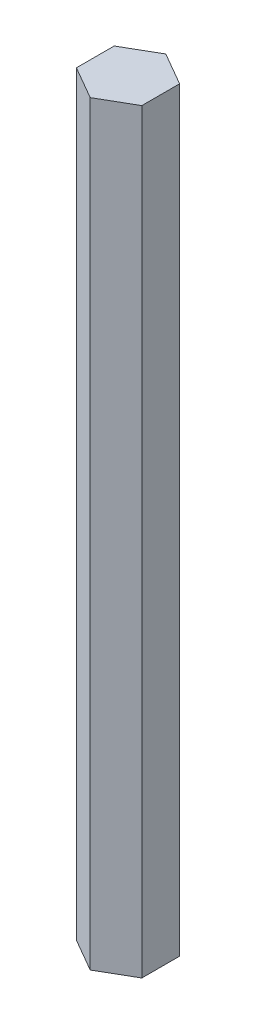
ISO-10303-21;
HEADER;
FILE_DESCRIPTION(('STEP AP214'),'2;1');
FILE_NAME('part.step','',(''),(''),'','','');
FILE_SCHEMA(('AUTOMOTIVE_DESIGN { 1 0 10303 214 1 1 1 1 }'));
ENDSEC;
DATA;
#1=APPLICATION_CONTEXT('core data for automotive mechanical design processes');
#2=APPLICATION_PROTOCOL_DEFINITION('international standard','automotive_design',2000,#1);
#3=PRODUCT_CONTEXT('',#1,'mechanical');
#4=PRODUCT('Part','Part','',(#3));
#5=PRODUCT_RELATED_PRODUCT_CATEGORY('part','',(#4));
#6=PRODUCT_DEFINITION_FORMATION('','',#4);
#7=PRODUCT_DEFINITION_CONTEXT('part definition',#1,'design');
#8=PRODUCT_DEFINITION('design','',#6,#7);
#9=PRODUCT_DEFINITION_SHAPE('','',#8);
#10=(LENGTH_UNIT() NAMED_UNIT(*) SI_UNIT(.MILLI.,.METRE.));
#11=(NAMED_UNIT(*) PLANE_ANGLE_UNIT() SI_UNIT($,.RADIAN.));
#12=(NAMED_UNIT(*) SI_UNIT($,.STERADIAN.) SOLID_ANGLE_UNIT());
#13=UNCERTAINTY_MEASURE_WITH_UNIT(LENGTH_MEASURE(1.E-05),#10,'distance_accuracy_value','');
#14=(GEOMETRIC_REPRESENTATION_CONTEXT(3) GLOBAL_UNCERTAINTY_ASSIGNED_CONTEXT((#13)) GLOBAL_UNIT_ASSIGNED_CONTEXT((#10,
#11,#12)) REPRESENTATION_CONTEXT('',''));
#15=CARTESIAN_POINT('',(0.,0.,0.));
#16=DIRECTION('',(0.,0.,1.));
#17=DIRECTION('',(1.,0.,0.));
#18=AXIS2_PLACEMENT_3D('',#15,#16,#17);
#19=CARTESIAN_POINT('',(-5.49926131403115,127.,3.17500000000006));
#20=DIRECTION('',(0.499999999999995,0.,-0.866025403784441));
#21=DIRECTION('',(-0.866025403784442,0.,-0.499999999999995));
#22=AXIS2_PLACEMENT_3D('',#19,#20,#21);
#23=PLANE('',#22);
#24=DIRECTION('',(0.866025403784441,0.,0.499999999999995));
#25=VECTOR('',#24,1.);
#26=CARTESIAN_POINT('',(-5.49926131403115,0.,3.17500000000006));
#27=LINE('',#26,#25);
#28=CARTESIAN_POINT('',(-5.49926131403115,0.,3.17500000000006));
#29=VERTEX_POINT('',#28);
#30=CARTESIAN_POINT('',(0.,0.,6.35));
#31=VERTEX_POINT('',#30);
#32=EDGE_CURVE('E117',#29,#31,#27,.T.);
#33=ORIENTED_EDGE('',*,*,#32,.T.);
#34=DIRECTION('',(0.,-1.,0.));
#35=VECTOR('',#34,1.);
#36=CARTESIAN_POINT('',(0.,127.,6.35));
#37=LINE('',#36,#35);
#38=CARTESIAN_POINT('',(0.,127.,6.35));
#39=VERTEX_POINT('',#38);
#40=EDGE_CURVE('E11',#39,#31,#37,.T.);
#41=ORIENTED_EDGE('',*,*,#40,.F.);
#42=DIRECTION('',(0.866025403784441,0.,0.499999999999995));
#43=VECTOR('',#42,1.);
#44=CARTESIAN_POINT('',(-5.49926131403115,127.,3.17500000000006));
#45=LINE('',#44,#43);
#46=CARTESIAN_POINT('',(-5.49926131403115,127.,3.17500000000006));
#47=VERTEX_POINT('',#46);
#48=EDGE_CURVE('E127',#47,#39,#45,.T.);
#49=ORIENTED_EDGE('',*,*,#48,.F.);
#50=DIRECTION('',(0.,-1.,0.));
#51=VECTOR('',#50,1.);
#52=CARTESIAN_POINT('',(-5.49926131403115,127.,3.17500000000006));
#53=LINE('',#52,#51);
#54=EDGE_CURVE('E113',#47,#29,#53,.T.);
#55=ORIENTED_EDGE('',*,*,#54,.T.);
#56=EDGE_LOOP('',(#33,#41,#49,#55));
#57=FACE_BOUND('',#56,.T.);
#58=ADVANCED_FACE('F33',(#57),#23,.F.);
#59=CARTESIAN_POINT('',(0.,127.,6.35));
#60=DIRECTION('',(-0.500000000000001,0.,-0.866025403784438));
#61=DIRECTION('',(-0.866025403784438,0.,0.500000000000001));
#62=AXIS2_PLACEMENT_3D('',#59,#60,#61);
#63=PLANE('',#62);
#64=DIRECTION('',(0.866025403784438,0.,-0.500000000000001));
#65=VECTOR('',#64,1.);
#66=CARTESIAN_POINT('',(0.,0.,6.35));
#67=LINE('',#66,#65);
#68=CARTESIAN_POINT('',(5.49926131403119,0.,3.17499999999999));
#69=VERTEX_POINT('',#68);
#70=EDGE_CURVE('E120',#31,#69,#67,.T.);
#71=ORIENTED_EDGE('',*,*,#70,.T.);
#72=DIRECTION('',(0.,-1.,0.));
#73=VECTOR('',#72,1.);
#74=CARTESIAN_POINT('',(5.49926131403119,127.,3.17499999999999));
#75=LINE('',#74,#73);
#76=CARTESIAN_POINT('',(5.49926131403119,127.,3.17499999999999));
#77=VERTEX_POINT('',#76);
#78=EDGE_CURVE('E41',#77,#69,#75,.T.);
#79=ORIENTED_EDGE('',*,*,#78,.F.);
#80=DIRECTION('',(0.866025403784438,0.,-0.500000000000001));
#81=VECTOR('',#80,1.);
#82=CARTESIAN_POINT('',(0.,127.,6.35));
#83=LINE('',#82,#81);
#84=EDGE_CURVE('E86',#39,#77,#83,.T.);
#85=ORIENTED_EDGE('',*,*,#84,.F.);
#86=ORIENTED_EDGE('',*,*,#40,.T.);
#87=EDGE_LOOP('',(#71,#79,#85,#86));
#88=FACE_BOUND('',#87,.T.);
#89=ADVANCED_FACE('F151',(#88),#63,.F.);
#90=CARTESIAN_POINT('',(5.49926131403119,127.,3.17499999999999));
#91=DIRECTION('',(-1.,0.,0.));
#92=DIRECTION('',(0.,0.,1.));
#93=AXIS2_PLACEMENT_3D('',#90,#91,#92);
#94=PLANE('',#93);
#95=DIRECTION('',(0.,0.,-1.));
#96=VECTOR('',#95,1.);
#97=CARTESIAN_POINT('',(5.49926131403119,0.,3.17499999999999));
#98=LINE('',#97,#96);
#99=CARTESIAN_POINT('',(5.49926131403117,0.,-3.17500000000003));
#100=VERTEX_POINT('',#99);
#101=EDGE_CURVE('E122',#69,#100,#98,.T.);
#102=ORIENTED_EDGE('',*,*,#101,.T.);
#103=DIRECTION('',(0.,-1.,0.));
#104=VECTOR('',#103,1.);
#105=CARTESIAN_POINT('',(5.49926131403117,127.,-3.17500000000003));
#106=LINE('',#105,#104);
#107=CARTESIAN_POINT('',(5.49926131403117,127.,-3.17500000000003));
#108=VERTEX_POINT('',#107);
#109=EDGE_CURVE('E108',#108,#100,#106,.T.);
#110=ORIENTED_EDGE('',*,*,#109,.F.);
#111=DIRECTION('',(0.,0.,-1.));
#112=VECTOR('',#111,1.);
#113=CARTESIAN_POINT('',(5.49926131403119,127.,3.17499999999999));
#114=LINE('',#113,#112);
#115=EDGE_CURVE('E99',#77,#108,#114,.T.);
#116=ORIENTED_EDGE('',*,*,#115,.F.);
#117=ORIENTED_EDGE('',*,*,#78,.T.);
#118=EDGE_LOOP('',(#102,#110,#116,#117));
#119=FACE_BOUND('',#118,.T.);
#120=ADVANCED_FACE('F133',(#119),#94,.F.);
#121=CARTESIAN_POINT('',(5.49926131403117,127.,-3.17500000000003));
#122=DIRECTION('',(-0.499999999999995,0.,0.866025403784441));
#123=DIRECTION('',(0.866025403784441,0.,0.499999999999995));
#124=AXIS2_PLACEMENT_3D('',#121,#122,#123);
#125=PLANE('',#124);
#126=DIRECTION('',(-0.866025403784441,0.,-0.499999999999995));
#127=VECTOR('',#126,1.);
#128=CARTESIAN_POINT('',(5.49926131403117,0.,-3.17500000000003));
#129=LINE('',#128,#127);
#130=CARTESIAN_POINT('',(0.,0.,-6.35));
#131=VERTEX_POINT('',#130);
#132=EDGE_CURVE('E107',#100,#131,#129,.T.);
#133=ORIENTED_EDGE('',*,*,#132,.T.);
#134=DIRECTION('',(0.,-1.,0.));
#135=VECTOR('',#134,1.);
#136=CARTESIAN_POINT('',(0.,127.,-6.35));
#137=LINE('',#136,#135);
#138=CARTESIAN_POINT('',(0.,127.,-6.35));
#139=VERTEX_POINT('',#138);
#140=EDGE_CURVE('E104',#139,#131,#137,.T.);
#141=ORIENTED_EDGE('',*,*,#140,.F.);
#142=DIRECTION('',(-0.866025403784441,0.,-0.499999999999995));
#143=VECTOR('',#142,1.);
#144=CARTESIAN_POINT('',(5.49926131403117,127.,-3.17500000000003));
#145=LINE('',#144,#143);
#146=EDGE_CURVE('E93',#108,#139,#145,.T.);
#147=ORIENTED_EDGE('',*,*,#146,.F.);
#148=ORIENTED_EDGE('',*,*,#109,.T.);
#149=EDGE_LOOP('',(#133,#141,#147,#148));
#150=FACE_BOUND('',#149,.T.);
#151=ADVANCED_FACE('F105',(#150),#125,.F.);
#152=CARTESIAN_POINT('',(0.,127.,-6.35));
#153=DIRECTION('',(0.500000000000007,0.,0.866025403784434));
#154=DIRECTION('',(0.866025403784435,0.,-0.500000000000007));
#155=AXIS2_PLACEMENT_3D('',#152,#153,#154);
#156=PLANE('',#155);
#157=DIRECTION('',(-0.866025403784434,0.,0.500000000000007));
#158=VECTOR('',#157,1.);
#159=CARTESIAN_POINT('',(0.,0.,-6.35));
#160=LINE('',#159,#158);
#161=CARTESIAN_POINT('',(-5.49926131403121,0.,-3.17499999999995));
#162=VERTEX_POINT('',#161);
#163=EDGE_CURVE('E72',#131,#162,#160,.T.);
#164=ORIENTED_EDGE('',*,*,#163,.T.);
#165=DIRECTION('',(0.,-1.,0.));
#166=VECTOR('',#165,1.);
#167=CARTESIAN_POINT('',(-5.49926131403121,127.,-3.17499999999995));
#168=LINE('',#167,#166);
#169=CARTESIAN_POINT('',(-5.49926131403121,127.,-3.17499999999995));
#170=VERTEX_POINT('',#169);
#171=EDGE_CURVE('E109',#170,#162,#168,.T.);
#172=ORIENTED_EDGE('',*,*,#171,.F.);
#173=DIRECTION('',(-0.866025403784434,0.,0.500000000000007));
#174=VECTOR('',#173,1.);
#175=CARTESIAN_POINT('',(0.,127.,-6.35));
#176=LINE('',#175,#174);
#177=EDGE_CURVE('E97',#139,#170,#176,.T.);
#178=ORIENTED_EDGE('',*,*,#177,.F.);
#179=ORIENTED_EDGE('',*,*,#140,.T.);
#180=EDGE_LOOP('',(#164,#172,#178,#179));
#181=FACE_BOUND('',#180,.T.);
#182=ADVANCED_FACE('F111',(#181),#156,.F.);
#183=CARTESIAN_POINT('',(-5.49926131403121,127.,-3.17499999999995));
#184=DIRECTION('',(1.,0.,0.));
#185=DIRECTION('',(0.,0.,-1.));
#186=AXIS2_PLACEMENT_3D('',#183,#184,#185);
#187=PLANE('',#186);
#188=DIRECTION('',(0.,0.,1.));
#189=VECTOR('',#188,1.);
#190=CARTESIAN_POINT('',(-5.49926131403121,0.,-3.17499999999995));
#191=LINE('',#190,#189);
#192=EDGE_CURVE('E78',#162,#29,#191,.T.);
#193=ORIENTED_EDGE('',*,*,#192,.T.);
#194=ORIENTED_EDGE('',*,*,#54,.F.);
#195=DIRECTION('',(0.,0.,1.));
#196=VECTOR('',#195,1.);
#197=CARTESIAN_POINT('',(-5.49926131403121,127.,-3.17499999999995));
#198=LINE('',#197,#196);
#199=EDGE_CURVE('E49',#170,#47,#198,.T.);
#200=ORIENTED_EDGE('',*,*,#199,.F.);
#201=ORIENTED_EDGE('',*,*,#171,.T.);
#202=EDGE_LOOP('',(#193,#194,#200,#201));
#203=FACE_BOUND('',#202,.T.);
#204=ADVANCED_FACE('F140',(#203),#187,.F.);
#205=CARTESIAN_POINT('',(0.,127.,0.));
#206=DIRECTION('',(0.,1.,0.));
#207=DIRECTION('',(0.,0.,1.));
#208=AXIS2_PLACEMENT_3D('',#205,#206,#207);
#209=PLANE('',#208);
#210=ORIENTED_EDGE('',*,*,#48,.T.);
#211=ORIENTED_EDGE('',*,*,#84,.T.);
#212=ORIENTED_EDGE('',*,*,#115,.T.);
#213=ORIENTED_EDGE('',*,*,#146,.T.);
#214=ORIENTED_EDGE('',*,*,#177,.T.);
#215=ORIENTED_EDGE('',*,*,#199,.T.);
#216=EDGE_LOOP('',(#210,#211,#212,#213,#214,#215));
#217=FACE_BOUND('',#216,.T.);
#218=ADVANCED_FACE('F95',(#217),#209,.T.);
#219=CARTESIAN_POINT('',(0.,0.,0.));
#220=DIRECTION('',(0.,1.,0.));
#221=DIRECTION('',(0.,0.,1.));
#222=AXIS2_PLACEMENT_3D('',#219,#220,#221);
#223=PLANE('',#222);
#224=ORIENTED_EDGE('',*,*,#32,.F.);
#225=ORIENTED_EDGE('',*,*,#192,.F.);
#226=ORIENTED_EDGE('',*,*,#163,.F.);
#227=ORIENTED_EDGE('',*,*,#132,.F.);
#228=ORIENTED_EDGE('',*,*,#101,.F.);
#229=ORIENTED_EDGE('',*,*,#70,.F.);
#230=EDGE_LOOP('',(#224,#225,#226,#227,#228,#229));
#231=FACE_BOUND('',#230,.T.);
#232=ADVANCED_FACE('F136',(#231),#223,.F.);
#233=CLOSED_SHELL('',(#58,#89,#120,#151,#182,#204,#218,#232));
#234=MANIFOLD_SOLID_BREP('B2',#233);
#235=ADVANCED_BREP_SHAPE_REPRESENTATION('',(#18,#234),#14);
#236=SHAPE_DEFINITION_REPRESENTATION(#9,#235);
ENDSEC;
END-ISO-10303-21;
